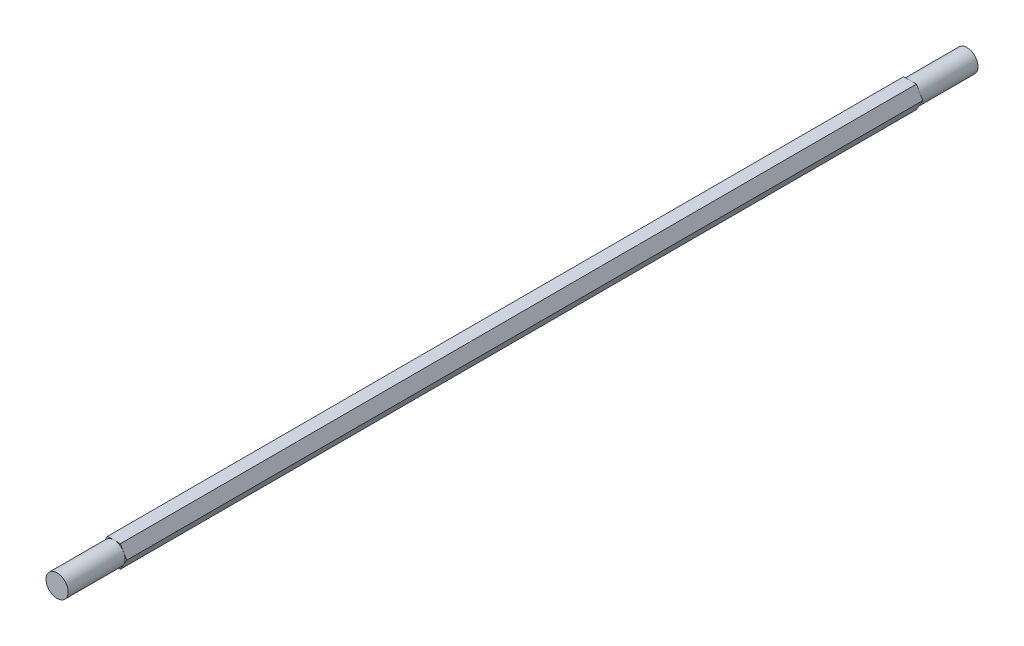
ISO-10303-21;
HEADER;
FILE_DESCRIPTION(('STEP AP214'),'2;1');
FILE_NAME('part.step','',(''),(''),'','','');
FILE_SCHEMA(('AUTOMOTIVE_DESIGN { 1 0 10303 214 1 1 1 1 }'));
ENDSEC;
DATA;
#1=APPLICATION_CONTEXT('core data for automotive mechanical design processes');
#2=APPLICATION_PROTOCOL_DEFINITION('international standard','automotive_design',2000,#1);
#3=PRODUCT_CONTEXT('',#1,'mechanical');
#4=PRODUCT('Part','Part','',(#3));
#5=PRODUCT_RELATED_PRODUCT_CATEGORY('part','',(#4));
#6=PRODUCT_DEFINITION_FORMATION('','',#4);
#7=PRODUCT_DEFINITION_CONTEXT('part definition',#1,'design');
#8=PRODUCT_DEFINITION('design','',#6,#7);
#9=PRODUCT_DEFINITION_SHAPE('','',#8);
#10=(LENGTH_UNIT() NAMED_UNIT(*) SI_UNIT(.MILLI.,.METRE.));
#11=(NAMED_UNIT(*) PLANE_ANGLE_UNIT() SI_UNIT($,.RADIAN.));
#12=(NAMED_UNIT(*) SI_UNIT($,.STERADIAN.) SOLID_ANGLE_UNIT());
#13=UNCERTAINTY_MEASURE_WITH_UNIT(LENGTH_MEASURE(1.E-05),#10,'distance_accuracy_value','');
#14=(GEOMETRIC_REPRESENTATION_CONTEXT(3) GLOBAL_UNCERTAINTY_ASSIGNED_CONTEXT((#13)) GLOBAL_UNIT_ASSIGNED_CONTEXT((#10,
#11,#12)) REPRESENTATION_CONTEXT('',''));
#15=CARTESIAN_POINT('',(0.,0.,0.));
#16=DIRECTION('',(0.,0.,1.));
#17=DIRECTION('',(1.,0.,0.));
#18=AXIS2_PLACEMENT_3D('',#15,#16,#17);
#19=CARTESIAN_POINT('',(0.,0.,-203.2));
#20=DIRECTION('',(0.,0.,1.));
#21=DIRECTION('',(1.,0.,0.));
#22=AXIS2_PLACEMENT_3D('',#19,#20,#21);
#23=CYLINDRICAL_SURFACE('',#22,4.953);
#24=CARTESIAN_POINT('',(0.,0.,-203.2));
#25=DIRECTION('',(0.,0.,1.));
#26=DIRECTION('',(1.,0.,0.));
#27=AXIS2_PLACEMENT_3D('',#24,#25,#26);
#28=CIRCLE('',#27,4.953);
#29=CARTESIAN_POINT('',(4.953,0.,-203.2));
#30=VERTEX_POINT('',#29);
#31=EDGE_CURVE('E236',#30,#30,#28,.T.);
#32=ORIENTED_EDGE('',*,*,#31,.T.);
#33=EDGE_LOOP('',(#32));
#34=FACE_BOUND('',#33,.T.);
#35=CARTESIAN_POINT('',(0.,0.,-177.8));
#36=DIRECTION('',(0.,0.,1.));
#37=DIRECTION('',(1.,0.,0.));
#38=AXIS2_PLACEMENT_3D('',#35,#36,#37);
#39=CIRCLE('',#38,4.953);
#40=CARTESIAN_POINT('',(4.28942382494432,2.4765,-177.8));
#41=VERTEX_POINT('',#40);
#42=CARTESIAN_POINT('',(4.28942382494432,-2.4765,-177.8));
#43=VERTEX_POINT('',#42);
#44=EDGE_CURVE('E49',#41,#43,#39,.F.);
#45=ORIENTED_EDGE('',*,*,#44,.T.);
#46=CARTESIAN_POINT('',(0.,-4.953,-177.8));
#47=VERTEX_POINT('',#46);
#48=EDGE_CURVE('E11',#43,#47,#39,.F.);
#49=ORIENTED_EDGE('',*,*,#48,.T.);
#50=CARTESIAN_POINT('',(-4.28942382494432,-2.4765,-177.8));
#51=VERTEX_POINT('',#50);
#52=EDGE_CURVE('E55',#47,#51,#39,.F.);
#53=ORIENTED_EDGE('',*,*,#52,.T.);
#54=CARTESIAN_POINT('',(-4.28942382494432,2.4765,-177.8));
#55=VERTEX_POINT('',#54);
#56=EDGE_CURVE('E491',#51,#55,#39,.F.);
#57=ORIENTED_EDGE('',*,*,#56,.T.);
#58=CARTESIAN_POINT('',(0.,4.953,-177.8));
#59=VERTEX_POINT('',#58);
#60=EDGE_CURVE('E281',#55,#59,#39,.F.);
#61=ORIENTED_EDGE('',*,*,#60,.T.);
#62=EDGE_CURVE('E251',#59,#41,#39,.F.);
#63=ORIENTED_EDGE('',*,*,#62,.T.);
#64=EDGE_LOOP('',(#45,#49,#53,#57,#61,#63));
#65=FACE_BOUND('',#64,.T.);
#66=ADVANCED_FACE('F45',(#34,#65),#23,.T.);
#67=CARTESIAN_POINT('',(0.,0.,-203.2));
#68=DIRECTION('',(0.,0.,1.));
#69=DIRECTION('',(1.,0.,0.));
#70=AXIS2_PLACEMENT_3D('',#67,#68,#69);
#71=PLANE('',#70);
#72=ORIENTED_EDGE('',*,*,#31,.F.);
#73=EDGE_LOOP('',(#72));
#74=FACE_BOUND('',#73,.T.);
#75=ADVANCED_FACE('F329',(#74),#71,.F.);
#76=CARTESIAN_POINT('',(2.85961588329622,-4.953,-177.8));
#77=DIRECTION('',(0.866025403784439,-0.5,0.));
#78=DIRECTION('',(0.5,0.866025403784439,0.));
#79=AXIS2_PLACEMENT_3D('',#76,#77,#78);
#80=PLANE('',#79);
#81=DIRECTION('',(0.5,0.866025403784439,0.));
#82=VECTOR('',#81,1.);
#83=CARTESIAN_POINT('',(2.85961588329622,-4.953,-177.8));
#84=LINE('',#83,#82);
#85=CARTESIAN_POINT('',(2.85961588329622,-4.953,-177.8));
#86=VERTEX_POINT('',#85);
#87=EDGE_CURVE('E62',#86,#43,#84,.T.);
#88=ORIENTED_EDGE('',*,*,#87,.T.);
#89=CARTESIAN_POINT('',(5.71923176659243,0.,-177.8));
#90=VERTEX_POINT('',#89);
#91=EDGE_CURVE('E152',#43,#90,#84,.T.);
#92=ORIENTED_EDGE('',*,*,#91,.T.);
#93=DIRECTION('',(0.,0.,1.));
#94=VECTOR('',#93,1.);
#95=CARTESIAN_POINT('',(5.71923176659243,0.,-177.8));
#96=LINE('',#95,#94);
#97=CARTESIAN_POINT('',(5.71923176659243,0.,177.8));
#98=VERTEX_POINT('',#97);
#99=EDGE_CURVE('E150',#90,#98,#96,.T.);
#100=ORIENTED_EDGE('',*,*,#99,.T.);
#101=DIRECTION('',(0.5,0.866025403784439,0.));
#102=VECTOR('',#101,1.);
#103=CARTESIAN_POINT('',(2.85961588329622,-4.953,177.8));
#104=LINE('',#103,#102);
#105=CARTESIAN_POINT('',(4.28942382494432,-2.4765,177.8));
#106=VERTEX_POINT('',#105);
#107=EDGE_CURVE('E138',#106,#98,#104,.T.);
#108=ORIENTED_EDGE('',*,*,#107,.F.);
#109=CARTESIAN_POINT('',(2.85961588329622,-4.953,177.8));
#110=VERTEX_POINT('',#109);
#111=EDGE_CURVE('E147',#110,#106,#104,.T.);
#112=ORIENTED_EDGE('',*,*,#111,.F.);
#113=DIRECTION('',(0.,0.,1.));
#114=VECTOR('',#113,1.);
#115=CARTESIAN_POINT('',(2.85961588329622,-4.953,-177.8));
#116=LINE('',#115,#114);
#117=EDGE_CURVE('E214',#86,#110,#116,.T.);
#118=ORIENTED_EDGE('',*,*,#117,.F.);
#119=EDGE_LOOP('',(#88,#92,#100,#108,#112,#118));
#120=FACE_BOUND('',#119,.T.);
#121=ADVANCED_FACE('F151',(#120),#80,.T.);
#122=CARTESIAN_POINT('',(-2.85961588329621,-4.953,-177.8));
#123=DIRECTION('',(0.,-1.,0.));
#124=DIRECTION('',(0.,0.,-1.));
#125=AXIS2_PLACEMENT_3D('',#122,#123,#124);
#126=PLANE('',#125);
#127=DIRECTION('',(1.,0.,0.));
#128=VECTOR('',#127,1.);
#129=CARTESIAN_POINT('',(-2.85961588329621,-4.953,-177.8));
#130=LINE('',#129,#128);
#131=CARTESIAN_POINT('',(-2.85961588329621,-4.953,-177.8));
#132=VERTEX_POINT('',#131);
#133=EDGE_CURVE('E158',#132,#47,#130,.T.);
#134=ORIENTED_EDGE('',*,*,#133,.T.);
#135=EDGE_CURVE('E210',#47,#86,#130,.T.);
#136=ORIENTED_EDGE('',*,*,#135,.T.);
#137=ORIENTED_EDGE('',*,*,#117,.T.);
#138=DIRECTION('',(1.,0.,0.));
#139=VECTOR('',#138,1.);
#140=CARTESIAN_POINT('',(-2.85961588329621,-4.953,177.8));
#141=LINE('',#140,#139);
#142=CARTESIAN_POINT('',(0.,-4.953,177.8));
#143=VERTEX_POINT('',#142);
#144=EDGE_CURVE('E184',#143,#110,#141,.T.);
#145=ORIENTED_EDGE('',*,*,#144,.F.);
#146=CARTESIAN_POINT('',(-2.85961588329621,-4.953,177.8));
#147=VERTEX_POINT('',#146);
#148=EDGE_CURVE('E185',#147,#143,#141,.T.);
#149=ORIENTED_EDGE('',*,*,#148,.F.);
#150=DIRECTION('',(0.,0.,1.));
#151=VECTOR('',#150,1.);
#152=CARTESIAN_POINT('',(-2.85961588329621,-4.953,-177.8));
#153=LINE('',#152,#151);
#154=EDGE_CURVE('E219',#132,#147,#153,.T.);
#155=ORIENTED_EDGE('',*,*,#154,.F.);
#156=EDGE_LOOP('',(#134,#136,#137,#145,#149,#155));
#157=FACE_BOUND('',#156,.T.);
#158=ADVANCED_FACE('F305',(#157),#126,.T.);
#159=CARTESIAN_POINT('',(-5.71923176659243,0.,-177.8));
#160=DIRECTION('',(-0.866025403784438,-0.5,0.));
#161=DIRECTION('',(0.5,-0.866025403784439,0.));
#162=AXIS2_PLACEMENT_3D('',#159,#160,#161);
#163=PLANE('',#162);
#164=DIRECTION('',(0.5,-0.866025403784439,0.));
#165=VECTOR('',#164,1.);
#166=CARTESIAN_POINT('',(-5.71923176659243,0.,-177.8));
#167=LINE('',#166,#165);
#168=CARTESIAN_POINT('',(-5.71923176659243,0.,-177.8));
#169=VERTEX_POINT('',#168);
#170=EDGE_CURVE('E206',#169,#51,#167,.T.);
#171=ORIENTED_EDGE('',*,*,#170,.T.);
#172=EDGE_CURVE('E205',#51,#132,#167,.T.);
#173=ORIENTED_EDGE('',*,*,#172,.T.);
#174=ORIENTED_EDGE('',*,*,#154,.T.);
#175=DIRECTION('',(0.5,-0.866025403784439,0.));
#176=VECTOR('',#175,1.);
#177=CARTESIAN_POINT('',(-5.71923176659243,0.,177.8));
#178=LINE('',#177,#176);
#179=CARTESIAN_POINT('',(-4.28942382494432,-2.4765,177.8));
#180=VERTEX_POINT('',#179);
#181=EDGE_CURVE('E179',#180,#147,#178,.T.);
#182=ORIENTED_EDGE('',*,*,#181,.F.);
#183=CARTESIAN_POINT('',(-5.71923176659243,0.,177.8));
#184=VERTEX_POINT('',#183);
#185=EDGE_CURVE('E180',#184,#180,#178,.T.);
#186=ORIENTED_EDGE('',*,*,#185,.F.);
#187=DIRECTION('',(0.,0.,1.));
#188=VECTOR('',#187,1.);
#189=CARTESIAN_POINT('',(-5.71923176659243,0.,-177.8));
#190=LINE('',#189,#188);
#191=EDGE_CURVE('E223',#169,#184,#190,.T.);
#192=ORIENTED_EDGE('',*,*,#191,.F.);
#193=EDGE_LOOP('',(#171,#173,#174,#182,#186,#192));
#194=FACE_BOUND('',#193,.T.);
#195=ADVANCED_FACE('F300',(#194),#163,.T.);
#196=CARTESIAN_POINT('',(-2.85961588329621,4.953,-177.8));
#197=DIRECTION('',(-0.866025403784439,0.5,0.));
#198=DIRECTION('',(-0.5,-0.866025403784439,0.));
#199=AXIS2_PLACEMENT_3D('',#196,#197,#198);
#200=PLANE('',#199);
#201=DIRECTION('',(-0.5,-0.866025403784439,0.));
#202=VECTOR('',#201,1.);
#203=CARTESIAN_POINT('',(-2.85961588329621,4.953,-177.8));
#204=LINE('',#203,#202);
#205=CARTESIAN_POINT('',(-2.85961588329621,4.953,-177.8));
#206=VERTEX_POINT('',#205);
#207=EDGE_CURVE('E201',#206,#55,#204,.T.);
#208=ORIENTED_EDGE('',*,*,#207,.T.);
#209=EDGE_CURVE('E200',#55,#169,#204,.T.);
#210=ORIENTED_EDGE('',*,*,#209,.T.);
#211=ORIENTED_EDGE('',*,*,#191,.T.);
#212=DIRECTION('',(-0.5,-0.866025403784439,0.));
#213=VECTOR('',#212,1.);
#214=CARTESIAN_POINT('',(-2.85961588329621,4.953,177.8));
#215=LINE('',#214,#213);
#216=CARTESIAN_POINT('',(-4.28942382494432,2.4765,177.8));
#217=VERTEX_POINT('',#216);
#218=EDGE_CURVE('E174',#217,#184,#215,.T.);
#219=ORIENTED_EDGE('',*,*,#218,.F.);
#220=CARTESIAN_POINT('',(-2.85961588329621,4.953,177.8));
#221=VERTEX_POINT('',#220);
#222=EDGE_CURVE('E175',#221,#217,#215,.T.);
#223=ORIENTED_EDGE('',*,*,#222,.F.);
#224=DIRECTION('',(0.,0.,1.));
#225=VECTOR('',#224,1.);
#226=CARTESIAN_POINT('',(-2.85961588329621,4.953,-177.8));
#227=LINE('',#226,#225);
#228=EDGE_CURVE('E227',#206,#221,#227,.T.);
#229=ORIENTED_EDGE('',*,*,#228,.F.);
#230=EDGE_LOOP('',(#208,#210,#211,#219,#223,#229));
#231=FACE_BOUND('',#230,.T.);
#232=ADVANCED_FACE('F297',(#231),#200,.T.);
#233=CARTESIAN_POINT('',(2.85961588329622,4.953,-177.8));
#234=DIRECTION('',(0.,1.,0.));
#235=DIRECTION('',(-1.,0.,0.));
#236=AXIS2_PLACEMENT_3D('',#233,#234,#235);
#237=PLANE('',#236);
#238=DIRECTION('',(-1.,0.,0.));
#239=VECTOR('',#238,1.);
#240=CARTESIAN_POINT('',(2.85961588329622,4.953,-177.8));
#241=LINE('',#240,#239);
#242=CARTESIAN_POINT('',(2.85961588329622,4.953,-177.8));
#243=VERTEX_POINT('',#242);
#244=EDGE_CURVE('E196',#243,#59,#241,.T.);
#245=ORIENTED_EDGE('',*,*,#244,.T.);
#246=EDGE_CURVE('E195',#59,#206,#241,.T.);
#247=ORIENTED_EDGE('',*,*,#246,.T.);
#248=ORIENTED_EDGE('',*,*,#228,.T.);
#249=DIRECTION('',(-1.,0.,0.));
#250=VECTOR('',#249,1.);
#251=CARTESIAN_POINT('',(2.85961588329622,4.953,177.8));
#252=LINE('',#251,#250);
#253=CARTESIAN_POINT('',(0.,4.953,177.8));
#254=VERTEX_POINT('',#253);
#255=EDGE_CURVE('E165',#254,#221,#252,.T.);
#256=ORIENTED_EDGE('',*,*,#255,.F.);
#257=CARTESIAN_POINT('',(2.85961588329622,4.953,177.8));
#258=VERTEX_POINT('',#257);
#259=EDGE_CURVE('E169',#258,#254,#252,.T.);
#260=ORIENTED_EDGE('',*,*,#259,.F.);
#261=DIRECTION('',(0.,0.,1.));
#262=VECTOR('',#261,1.);
#263=CARTESIAN_POINT('',(2.85961588329622,4.953,-177.8));
#264=LINE('',#263,#262);
#265=EDGE_CURVE('E157',#243,#258,#264,.T.);
#266=ORIENTED_EDGE('',*,*,#265,.F.);
#267=EDGE_LOOP('',(#245,#247,#248,#256,#260,#266));
#268=FACE_BOUND('',#267,.T.);
#269=ADVANCED_FACE('F267',(#268),#237,.T.);
#270=CARTESIAN_POINT('',(5.71923176659243,0.,-177.8));
#271=DIRECTION('',(0.866025403784439,0.5,0.));
#272=DIRECTION('',(-0.5,0.866025403784439,0.));
#273=AXIS2_PLACEMENT_3D('',#270,#271,#272);
#274=PLANE('',#273);
#275=DIRECTION('',(-0.5,0.866025403784438,0.));
#276=VECTOR('',#275,1.);
#277=CARTESIAN_POINT('',(5.71923176659243,0.,-177.8));
#278=LINE('',#277,#276);
#279=EDGE_CURVE('E192',#90,#41,#278,.T.);
#280=ORIENTED_EDGE('',*,*,#279,.T.);
#281=EDGE_CURVE('E191',#41,#243,#278,.T.);
#282=ORIENTED_EDGE('',*,*,#281,.T.);
#283=ORIENTED_EDGE('',*,*,#265,.T.);
#284=DIRECTION('',(-0.5,0.866025403784438,0.));
#285=VECTOR('',#284,1.);
#286=CARTESIAN_POINT('',(5.71923176659243,0.,177.8));
#287=LINE('',#286,#285);
#288=CARTESIAN_POINT('',(4.28942382494432,2.4765,177.8));
#289=VERTEX_POINT('',#288);
#290=EDGE_CURVE('E163',#289,#258,#287,.T.);
#291=ORIENTED_EDGE('',*,*,#290,.F.);
#292=EDGE_CURVE('E142',#98,#289,#287,.T.);
#293=ORIENTED_EDGE('',*,*,#292,.F.);
#294=ORIENTED_EDGE('',*,*,#99,.F.);
#295=EDGE_LOOP('',(#280,#282,#283,#291,#293,#294));
#296=FACE_BOUND('',#295,.T.);
#297=ADVANCED_FACE('F161',(#296),#274,.T.);
#298=CARTESIAN_POINT('',(0.,0.,-177.8));
#299=DIRECTION('',(0.,0.,1.));
#300=DIRECTION('',(1.,0.,0.));
#301=AXIS2_PLACEMENT_3D('',#298,#299,#300);
#302=PLANE('',#301);
#303=ORIENTED_EDGE('',*,*,#48,.F.);
#304=ORIENTED_EDGE('',*,*,#87,.F.);
#305=ORIENTED_EDGE('',*,*,#135,.F.);
#306=EDGE_LOOP('',(#303,#304,#305));
#307=FACE_BOUND('',#306,.T.);
#308=ADVANCED_FACE('F312',(#307),#302,.F.);
#309=ORIENTED_EDGE('',*,*,#52,.F.);
#310=ORIENTED_EDGE('',*,*,#133,.F.);
#311=ORIENTED_EDGE('',*,*,#172,.F.);
#312=EDGE_LOOP('',(#309,#310,#311));
#313=FACE_BOUND('',#312,.T.);
#314=ADVANCED_FACE('F326',(#313),#302,.F.);
#315=ORIENTED_EDGE('',*,*,#56,.F.);
#316=ORIENTED_EDGE('',*,*,#170,.F.);
#317=ORIENTED_EDGE('',*,*,#209,.F.);
#318=EDGE_LOOP('',(#315,#316,#317));
#319=FACE_BOUND('',#318,.T.);
#320=ADVANCED_FACE('F392',(#319),#302,.F.);
#321=ORIENTED_EDGE('',*,*,#60,.F.);
#322=ORIENTED_EDGE('',*,*,#207,.F.);
#323=ORIENTED_EDGE('',*,*,#246,.F.);
#324=EDGE_LOOP('',(#321,#322,#323));
#325=FACE_BOUND('',#324,.T.);
#326=ADVANCED_FACE('F284',(#325),#302,.F.);
#327=ORIENTED_EDGE('',*,*,#62,.F.);
#328=ORIENTED_EDGE('',*,*,#244,.F.);
#329=ORIENTED_EDGE('',*,*,#281,.F.);
#330=EDGE_LOOP('',(#327,#328,#329));
#331=FACE_BOUND('',#330,.T.);
#332=ADVANCED_FACE('F276',(#331),#302,.F.);
#333=CARTESIAN_POINT('',(0.,0.,177.8));
#334=DIRECTION('',(0.,0.,1.));
#335=DIRECTION('',(1.,0.,0.));
#336=AXIS2_PLACEMENT_3D('',#333,#334,#335);
#337=PLANE('',#336);
#338=ORIENTED_EDGE('',*,*,#111,.T.);
#339=CARTESIAN_POINT('',(0.,0.,177.8));
#340=DIRECTION('',(0.,0.,1.));
#341=DIRECTION('',(1.,0.,0.));
#342=AXIS2_PLACEMENT_3D('',#339,#340,#341);
#343=CIRCLE('',#342,4.953);
#344=EDGE_CURVE('E241',#106,#143,#343,.F.);
#345=ORIENTED_EDGE('',*,*,#344,.T.);
#346=ORIENTED_EDGE('',*,*,#144,.T.);
#347=EDGE_LOOP('',(#338,#345,#346));
#348=FACE_BOUND('',#347,.T.);
#349=ADVANCED_FACE('F307',(#348),#337,.T.);
#350=ORIENTED_EDGE('',*,*,#148,.T.);
#351=EDGE_CURVE('E70',#143,#180,#343,.F.);
#352=ORIENTED_EDGE('',*,*,#351,.T.);
#353=ORIENTED_EDGE('',*,*,#181,.T.);
#354=EDGE_LOOP('',(#350,#352,#353));
#355=FACE_BOUND('',#354,.T.);
#356=ADVANCED_FACE('F303',(#355),#337,.T.);
#357=ORIENTED_EDGE('',*,*,#185,.T.);
#358=EDGE_CURVE('E252',#180,#217,#343,.F.);
#359=ORIENTED_EDGE('',*,*,#358,.T.);
#360=ORIENTED_EDGE('',*,*,#218,.T.);
#361=EDGE_LOOP('',(#357,#359,#360));
#362=FACE_BOUND('',#361,.T.);
#363=ADVANCED_FACE('F293',(#362),#337,.T.);
#364=ORIENTED_EDGE('',*,*,#222,.T.);
#365=EDGE_CURVE('E244',#217,#254,#343,.F.);
#366=ORIENTED_EDGE('',*,*,#365,.T.);
#367=ORIENTED_EDGE('',*,*,#255,.T.);
#368=EDGE_LOOP('',(#364,#366,#367));
#369=FACE_BOUND('',#368,.T.);
#370=ADVANCED_FACE('F263',(#369),#337,.T.);
#371=ORIENTED_EDGE('',*,*,#259,.T.);
#372=EDGE_CURVE('E240',#254,#289,#343,.F.);
#373=ORIENTED_EDGE('',*,*,#372,.T.);
#374=ORIENTED_EDGE('',*,*,#290,.T.);
#375=EDGE_LOOP('',(#371,#373,#374));
#376=FACE_BOUND('',#375,.T.);
#377=ADVANCED_FACE('F271',(#376),#337,.T.);
#378=ORIENTED_EDGE('',*,*,#44,.F.);
#379=ORIENTED_EDGE('',*,*,#279,.F.);
#380=ORIENTED_EDGE('',*,*,#91,.F.);
#381=EDGE_LOOP('',(#378,#379,#380));
#382=FACE_BOUND('',#381,.T.);
#383=ADVANCED_FACE('F315',(#382),#302,.F.);
#384=ORIENTED_EDGE('',*,*,#292,.T.);
#385=EDGE_CURVE('E143',#289,#106,#343,.F.);
#386=ORIENTED_EDGE('',*,*,#385,.T.);
#387=ORIENTED_EDGE('',*,*,#107,.T.);
#388=EDGE_LOOP('',(#384,#386,#387));
#389=FACE_BOUND('',#388,.T.);
#390=ADVANCED_FACE('F140',(#389),#337,.T.);
#391=CARTESIAN_POINT('',(0.,0.,203.2));
#392=DIRECTION('',(0.,0.,1.));
#393=DIRECTION('',(1.,0.,0.));
#394=AXIS2_PLACEMENT_3D('',#391,#392,#393);
#395=PLANE('',#394);
#396=CARTESIAN_POINT('',(0.,0.,203.2));
#397=DIRECTION('',(0.,0.,1.));
#398=DIRECTION('',(1.,0.,0.));
#399=AXIS2_PLACEMENT_3D('',#396,#397,#398);
#400=CIRCLE('',#399,4.953);
#401=CARTESIAN_POINT('',(4.953,0.,203.2));
#402=VERTEX_POINT('',#401);
#403=EDGE_CURVE('E218',#402,#402,#400,.T.);
#404=ORIENTED_EDGE('',*,*,#403,.T.);
#405=EDGE_LOOP('',(#404));
#406=FACE_BOUND('',#405,.T.);
#407=ADVANCED_FACE('F322',(#406),#395,.T.);
#408=ORIENTED_EDGE('',*,*,#344,.F.);
#409=ORIENTED_EDGE('',*,*,#385,.F.);
#410=ORIENTED_EDGE('',*,*,#372,.F.);
#411=ORIENTED_EDGE('',*,*,#365,.F.);
#412=ORIENTED_EDGE('',*,*,#358,.F.);
#413=ORIENTED_EDGE('',*,*,#351,.F.);
#414=EDGE_LOOP('',(#408,#409,#410,#411,#412,#413));
#415=FACE_BOUND('',#414,.T.);
#416=ORIENTED_EDGE('',*,*,#403,.F.);
#417=EDGE_LOOP('',(#416));
#418=FACE_BOUND('',#417,.T.);
#419=ADVANCED_FACE('F47',(#415,#418),#23,.T.);
#420=CLOSED_SHELL('',(#66,#75,#121,#158,#195,#232,#269,#297,#308,#314,#320,#326,#332,#349,#356,
#363,#370,#377,#383,#390,#407,#419));
#421=MANIFOLD_SOLID_BREP('B2',#420);
#422=ADVANCED_BREP_SHAPE_REPRESENTATION('',(#18,#421),#14);
#423=SHAPE_DEFINITION_REPRESENTATION(#9,#422);
ENDSEC;
END-ISO-10303-21;
